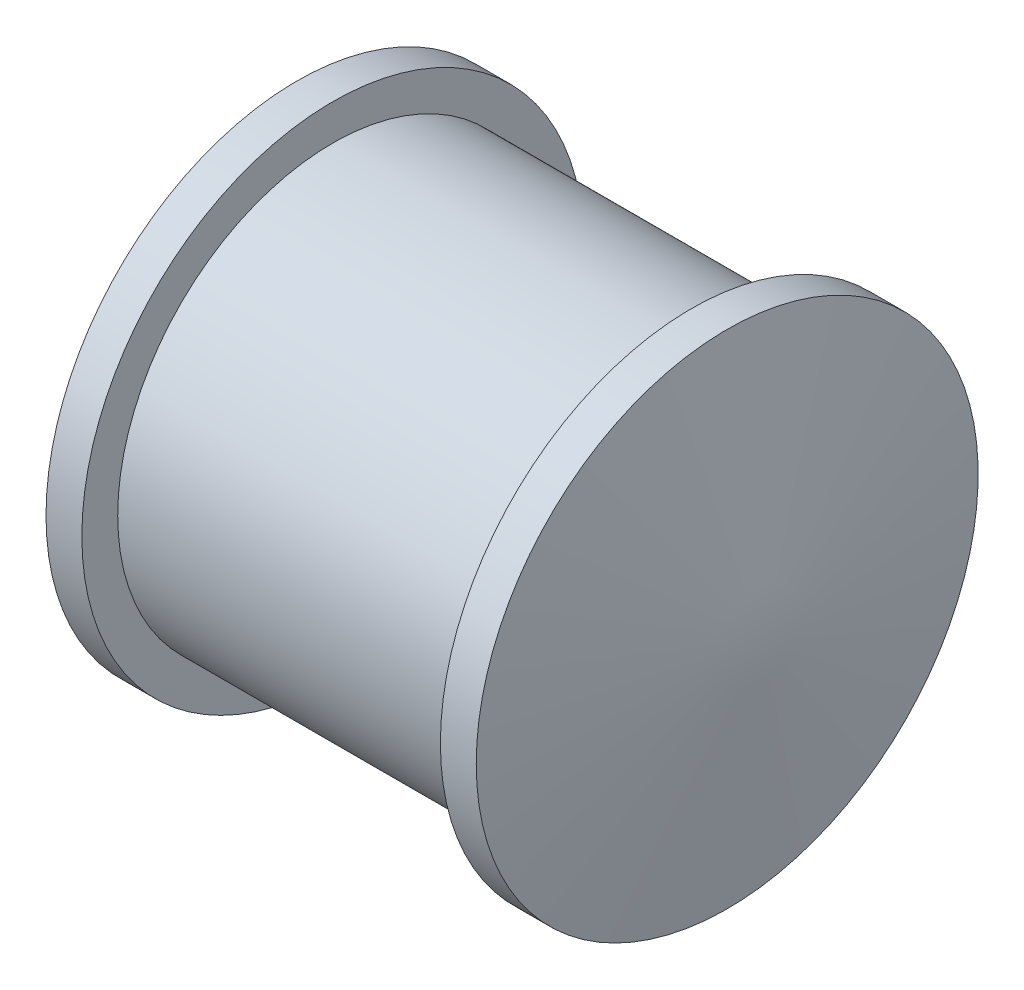
ISO-10303-21;
HEADER;
FILE_DESCRIPTION(('STEP AP214'),'2;1');
FILE_NAME('part.step','',(''),(''),'','','');
FILE_SCHEMA(('AUTOMOTIVE_DESIGN { 1 0 10303 214 1 1 1 1 }'));
ENDSEC;
DATA;
#1=APPLICATION_CONTEXT('core data for automotive mechanical design processes');
#2=APPLICATION_PROTOCOL_DEFINITION('international standard','automotive_design',2000,#1);
#3=PRODUCT_CONTEXT('',#1,'mechanical');
#4=PRODUCT('Part','Part','',(#3));
#5=PRODUCT_RELATED_PRODUCT_CATEGORY('part','',(#4));
#6=PRODUCT_DEFINITION_FORMATION('','',#4);
#7=PRODUCT_DEFINITION_CONTEXT('part definition',#1,'design');
#8=PRODUCT_DEFINITION('design','',#6,#7);
#9=PRODUCT_DEFINITION_SHAPE('','',#8);
#10=(LENGTH_UNIT() NAMED_UNIT(*) SI_UNIT(.MILLI.,.METRE.));
#11=(NAMED_UNIT(*) PLANE_ANGLE_UNIT() SI_UNIT($,.RADIAN.));
#12=(NAMED_UNIT(*) SI_UNIT($,.STERADIAN.) SOLID_ANGLE_UNIT());
#13=UNCERTAINTY_MEASURE_WITH_UNIT(LENGTH_MEASURE(1.E-05),#10,'distance_accuracy_value','');
#14=(GEOMETRIC_REPRESENTATION_CONTEXT(3) GLOBAL_UNCERTAINTY_ASSIGNED_CONTEXT((#13)) GLOBAL_UNIT_ASSIGNED_CONTEXT((#10,
#11,#12)) REPRESENTATION_CONTEXT('',''));
#15=CARTESIAN_POINT('',(0.,0.,0.));
#16=DIRECTION('',(0.,0.,1.));
#17=DIRECTION('',(1.,0.,0.));
#18=AXIS2_PLACEMENT_3D('',#15,#16,#17);
#19=CARTESIAN_POINT('',(3.,0.,0.));
#20=DIRECTION('',(-1.,0.,0.));
#21=DIRECTION('',(0.,0.,1.));
#22=AXIS2_PLACEMENT_3D('',#19,#20,#21);
#23=CONICAL_SURFACE('',#22,3.5,1.42889927219073);
#24=CARTESIAN_POINT('',(3.5,0.,0.));
#25=VERTEX_POINT('',#24);
#26=VERTEX_LOOP('',#25);
#27=FACE_BOUND('',#26,.T.);
#28=CARTESIAN_POINT('',(3.,0.,0.));
#29=DIRECTION('',(-1.,0.,0.));
#30=DIRECTION('',(0.,0.,1.));
#31=AXIS2_PLACEMENT_3D('',#28,#29,#30);
#32=CIRCLE('',#31,3.5);
#33=CARTESIAN_POINT('',(3.,0.,3.5));
#34=VERTEX_POINT('',#33);
#35=EDGE_CURVE('E11',#34,#34,#32,.T.);
#36=ORIENTED_EDGE('',*,*,#35,.F.);
#37=EDGE_LOOP('',(#36));
#38=FACE_BOUND('',#37,.T.);
#39=ADVANCED_FACE('F41',(#27,#38),#23,.T.);
#40=CARTESIAN_POINT('',(0.,0.,0.));
#41=DIRECTION('',(-1.,0.,0.));
#42=DIRECTION('',(0.,0.,1.));
#43=AXIS2_PLACEMENT_3D('',#40,#41,#42);
#44=CYLINDRICAL_SURFACE('',#43,3.5);
#45=ORIENTED_EDGE('',*,*,#35,.T.);
#46=EDGE_LOOP('',(#45));
#47=FACE_BOUND('',#46,.T.);
#48=CARTESIAN_POINT('',(2.5,0.,0.));
#49=DIRECTION('',(-1.,0.,0.));
#50=DIRECTION('',(0.,0.,1.));
#51=AXIS2_PLACEMENT_3D('',#48,#49,#50);
#52=CIRCLE('',#51,3.5);
#53=CARTESIAN_POINT('',(2.5,0.,3.5));
#54=VERTEX_POINT('',#53);
#55=EDGE_CURVE('E49',#54,#54,#52,.T.);
#56=ORIENTED_EDGE('',*,*,#55,.F.);
#57=EDGE_LOOP('',(#56));
#58=FACE_BOUND('',#57,.T.);
#59=ADVANCED_FACE('F84',(#47,#58),#44,.T.);
#60=CARTESIAN_POINT('',(2.5,0.,0.));
#61=DIRECTION('',(-1.,0.,0.));
#62=DIRECTION('',(0.,0.,1.));
#63=AXIS2_PLACEMENT_3D('',#60,#61,#62);
#64=PLANE('',#63);
#65=ORIENTED_EDGE('',*,*,#55,.T.);
#66=EDGE_LOOP('',(#65));
#67=FACE_BOUND('',#66,.T.);
#68=CARTESIAN_POINT('',(2.5,0.,0.));
#69=DIRECTION('',(-1.,0.,0.));
#70=DIRECTION('',(0.,0.,1.));
#71=AXIS2_PLACEMENT_3D('',#68,#69,#70);
#72=CIRCLE('',#71,3.);
#73=CARTESIAN_POINT('',(2.5,0.,3.));
#74=VERTEX_POINT('',#73);
#75=EDGE_CURVE('E66',#74,#74,#72,.T.);
#76=ORIENTED_EDGE('',*,*,#75,.F.);
#77=EDGE_LOOP('',(#76));
#78=FACE_BOUND('',#77,.T.);
#79=ADVANCED_FACE('F81',(#67,#78),#64,.T.);
#80=CARTESIAN_POINT('',(0.,0.,0.));
#81=DIRECTION('',(-1.,0.,0.));
#82=DIRECTION('',(0.,0.,1.));
#83=AXIS2_PLACEMENT_3D('',#80,#81,#82);
#84=CYLINDRICAL_SURFACE('',#83,3.);
#85=ORIENTED_EDGE('',*,*,#75,.T.);
#86=EDGE_LOOP('',(#85));
#87=FACE_BOUND('',#86,.T.);
#88=CARTESIAN_POINT('',(-2.5,0.,0.));
#89=DIRECTION('',(-1.,0.,0.));
#90=DIRECTION('',(0.,0.,1.));
#91=AXIS2_PLACEMENT_3D('',#88,#89,#90);
#92=CIRCLE('',#91,3.);
#93=CARTESIAN_POINT('',(-2.5,0.,3.));
#94=VERTEX_POINT('',#93);
#95=EDGE_CURVE('E74',#94,#94,#92,.T.);
#96=ORIENTED_EDGE('',*,*,#95,.F.);
#97=EDGE_LOOP('',(#96));
#98=FACE_BOUND('',#97,.T.);
#99=ADVANCED_FACE('F59',(#87,#98),#84,.T.);
#100=CARTESIAN_POINT('',(-3.,0.,0.));
#101=DIRECTION('',(1.,0.,0.));
#102=DIRECTION('',(0.,0.,1.));
#103=AXIS2_PLACEMENT_3D('',#100,#101,#102);
#104=CONICAL_SURFACE('',#103,3.5,1.42889927219073);
#105=CARTESIAN_POINT('',(-3.5,0.,0.));
#106=VERTEX_POINT('',#105);
#107=VERTEX_LOOP('',#106);
#108=FACE_BOUND('',#107,.T.);
#109=CARTESIAN_POINT('',(-3.,0.,0.));
#110=DIRECTION('',(-1.,0.,0.));
#111=DIRECTION('',(0.,0.,1.));
#112=AXIS2_PLACEMENT_3D('',#109,#110,#111);
#113=CIRCLE('',#112,3.5);
#114=CARTESIAN_POINT('',(-3.,0.,3.5));
#115=VERTEX_POINT('',#114);
#116=EDGE_CURVE('E63',#115,#115,#113,.T.);
#117=ORIENTED_EDGE('',*,*,#116,.T.);
#118=EDGE_LOOP('',(#117));
#119=FACE_BOUND('',#118,.T.);
#120=ADVANCED_FACE('F55',(#108,#119),#104,.T.);
#121=CARTESIAN_POINT('',(0.,0.,0.));
#122=DIRECTION('',(1.,0.,0.));
#123=DIRECTION('',(0.,0.,1.));
#124=AXIS2_PLACEMENT_3D('',#121,#122,#123);
#125=CYLINDRICAL_SURFACE('',#124,3.5);
#126=ORIENTED_EDGE('',*,*,#116,.F.);
#127=EDGE_LOOP('',(#126));
#128=FACE_BOUND('',#127,.T.);
#129=CARTESIAN_POINT('',(-2.5,0.,0.));
#130=DIRECTION('',(-1.,0.,0.));
#131=DIRECTION('',(0.,0.,1.));
#132=AXIS2_PLACEMENT_3D('',#129,#130,#131);
#133=CIRCLE('',#132,3.5);
#134=CARTESIAN_POINT('',(-2.5,0.,3.5));
#135=VERTEX_POINT('',#134);
#136=EDGE_CURVE('E67',#135,#135,#133,.T.);
#137=ORIENTED_EDGE('',*,*,#136,.T.);
#138=EDGE_LOOP('',(#137));
#139=FACE_BOUND('',#138,.T.);
#140=ADVANCED_FACE('F58',(#128,#139),#125,.T.);
#141=CARTESIAN_POINT('',(-2.5,0.,0.));
#142=DIRECTION('',(1.,0.,0.));
#143=DIRECTION('',(0.,0.,1.));
#144=AXIS2_PLACEMENT_3D('',#141,#142,#143);
#145=PLANE('',#144);
#146=ORIENTED_EDGE('',*,*,#136,.F.);
#147=EDGE_LOOP('',(#146));
#148=FACE_BOUND('',#147,.T.);
#149=ORIENTED_EDGE('',*,*,#95,.T.);
#150=EDGE_LOOP('',(#149));
#151=FACE_BOUND('',#150,.T.);
#152=ADVANCED_FACE('F98',(#148,#151),#145,.T.);
#153=CLOSED_SHELL('',(#39,#59,#79,#99,#120,#140,#152));
#154=MANIFOLD_SOLID_BREP('B2',#153);
#155=ADVANCED_BREP_SHAPE_REPRESENTATION('',(#18,#154),#14);
#156=SHAPE_DEFINITION_REPRESENTATION(#9,#155);
ENDSEC;
END-ISO-10303-21;
